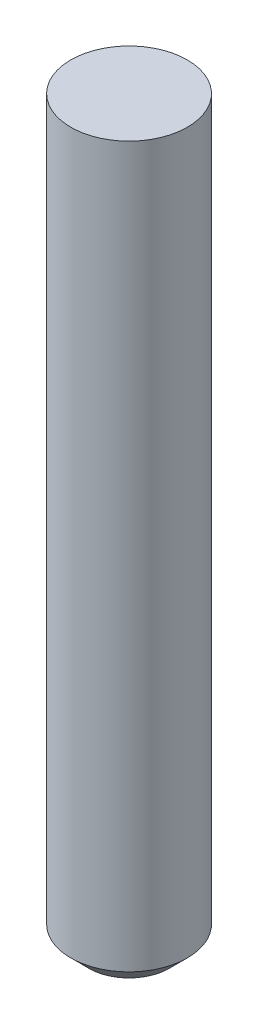
ISO-10303-21;
HEADER;
FILE_DESCRIPTION(('STEP AP214'),'2;1');
FILE_NAME('part.step','',(''),(''),'','','');
FILE_SCHEMA(('AUTOMOTIVE_DESIGN { 1 0 10303 214 1 1 1 1 }'));
ENDSEC;
DATA;
#1=APPLICATION_CONTEXT('core data for automotive mechanical design processes');
#2=APPLICATION_PROTOCOL_DEFINITION('international standard','automotive_design',2000,#1);
#3=PRODUCT_CONTEXT('',#1,'mechanical');
#4=PRODUCT('Part','Part','',(#3));
#5=PRODUCT_RELATED_PRODUCT_CATEGORY('part','',(#4));
#6=PRODUCT_DEFINITION_FORMATION('','',#4);
#7=PRODUCT_DEFINITION_CONTEXT('part definition',#1,'design');
#8=PRODUCT_DEFINITION('design','',#6,#7);
#9=PRODUCT_DEFINITION_SHAPE('','',#8);
#10=(LENGTH_UNIT() NAMED_UNIT(*) SI_UNIT(.MILLI.,.METRE.));
#11=(NAMED_UNIT(*) PLANE_ANGLE_UNIT() SI_UNIT($,.RADIAN.));
#12=(NAMED_UNIT(*) SI_UNIT($,.STERADIAN.) SOLID_ANGLE_UNIT());
#13=UNCERTAINTY_MEASURE_WITH_UNIT(LENGTH_MEASURE(1.E-05),#10,'distance_accuracy_value','');
#14=(GEOMETRIC_REPRESENTATION_CONTEXT(3) GLOBAL_UNCERTAINTY_ASSIGNED_CONTEXT((#13)) GLOBAL_UNIT_ASSIGNED_CONTEXT((#10,
#11,#12)) REPRESENTATION_CONTEXT('',''));
#15=CARTESIAN_POINT('',(0.,0.,0.));
#16=DIRECTION('',(0.,0.,1.));
#17=DIRECTION('',(1.,0.,0.));
#18=AXIS2_PLACEMENT_3D('',#15,#16,#17);
#19=CARTESIAN_POINT('',(2.,-15.12,-27.8));
#20=DIRECTION('',(0.,1.,0.));
#21=DIRECTION('',(0.,0.,1.));
#22=AXIS2_PLACEMENT_3D('',#19,#20,#21);
#23=CONICAL_SURFACE('',#22,0.55,0.7853981634);
#24=CARTESIAN_POINT('',(2.,-15.02,-27.8));
#25=DIRECTION('',(0.,-1.,0.));
#26=DIRECTION('',(0.,0.,1.));
#27=AXIS2_PLACEMENT_3D('',#24,#25,#26);
#28=CIRCLE('',#27,0.65);
#29=CARTESIAN_POINT('',(2.,-15.02,-28.45));
#30=VERTEX_POINT('',#29);
#31=EDGE_CURVE('E11',#30,#30,#28,.T.);
#32=ORIENTED_EDGE('',*,*,#31,.T.);
#33=CARTESIAN_POINT('',(2.,-15.22,-28.25));
#34=CARTESIAN_POINT('',(2.,-15.02,-28.45));
#35=B_SPLINE_CURVE_WITH_KNOTS('',1,(#33,#34),.UNSPECIFIED.,.F.,.F.,(2,2),(-0.141421356237311,
0.141421356237308),.UNSPECIFIED.);
#36=CARTESIAN_POINT('',(2.,-15.22,-28.25));
#37=VERTEX_POINT('',#36);
#38=EDGE_CURVE('E24',#37,#30,#35,.T.);
#39=ORIENTED_EDGE('',*,*,#38,.F.);
#40=CARTESIAN_POINT('',(2.,-15.22,-27.8));
#41=DIRECTION('',(0.,1.,0.));
#42=DIRECTION('',(0.,0.,1.));
#43=AXIS2_PLACEMENT_3D('',#40,#41,#42);
#44=CIRCLE('',#43,0.45);
#45=EDGE_CURVE('E42',#37,#37,#44,.T.);
#46=ORIENTED_EDGE('',*,*,#45,.T.);
#47=ORIENTED_EDGE('',*,*,#38,.T.);
#48=EDGE_LOOP('',(#32,#39,#46,#47));
#49=FACE_BOUND('',#48,.T.);
#50=ADVANCED_FACE('F17',(#49),#23,.T.);
#51=CARTESIAN_POINT('',(2.,-15.22,-27.8));
#52=DIRECTION('',(0.,-1.,0.));
#53=DIRECTION('',(0.,0.,-1.));
#54=AXIS2_PLACEMENT_3D('',#51,#52,#53);
#55=PLANE('',#54);
#56=ORIENTED_EDGE('',*,*,#45,.F.);
#57=EDGE_LOOP('',(#56));
#58=FACE_BOUND('',#57,.T.);
#59=ADVANCED_FACE('F55',(#58),#55,.T.);
#60=CARTESIAN_POINT('',(2.,-6.65,-27.8));
#61=DIRECTION('',(0.,-1.,0.));
#62=DIRECTION('',(0.,0.,-1.));
#63=AXIS2_PLACEMENT_3D('',#60,#61,#62);
#64=CYLINDRICAL_SURFACE('',#63,0.65);
#65=CARTESIAN_POINT('',(2.,-7.,-27.8));
#66=DIRECTION('',(0.,-1.,0.));
#67=DIRECTION('',(0.,0.,-1.));
#68=AXIS2_PLACEMENT_3D('',#65,#66,#67);
#69=CIRCLE('',#68,0.65);
#70=CARTESIAN_POINT('',(2.,-7.,-28.45));
#71=VERTEX_POINT('',#70);
#72=EDGE_CURVE('E38',#71,#71,#69,.T.);
#73=ORIENTED_EDGE('',*,*,#72,.T.);
#74=CARTESIAN_POINT('',(2.,-7.,-28.45));
#75=CARTESIAN_POINT('',(2.,-15.02,-28.45));
#76=B_SPLINE_CURVE_WITH_KNOTS('',1,(#74,#75),.UNSPECIFIED.,.F.,.F.,(2,2),(0.35,8.37),.UNSPECIFIED.);
#77=EDGE_CURVE('E40',#71,#30,#76,.T.);
#78=ORIENTED_EDGE('',*,*,#77,.T.);
#79=ORIENTED_EDGE('',*,*,#31,.F.);
#80=ORIENTED_EDGE('',*,*,#77,.F.);
#81=EDGE_LOOP('',(#73,#78,#79,#80));
#82=FACE_BOUND('',#81,.T.);
#83=ADVANCED_FACE('F39',(#82),#64,.T.);
#84=CARTESIAN_POINT('',(24.43110368616,-7.,-27.15));
#85=DIRECTION('',(0.,1.,0.));
#86=DIRECTION('',(0.,0.,-1.));
#87=AXIS2_PLACEMENT_3D('',#84,#85,#86);
#88=PLANE('',#87);
#89=ORIENTED_EDGE('',*,*,#72,.F.);
#90=EDGE_LOOP('',(#89));
#91=FACE_BOUND('',#90,.T.);
#92=ADVANCED_FACE('F62',(#91),#88,.T.);
#93=CLOSED_SHELL('',(#50,#59,#83,#92));
#94=MANIFOLD_SOLID_BREP('B1',#93);
#95=ADVANCED_BREP_SHAPE_REPRESENTATION('',(#18,#94),#14);
#96=SHAPE_DEFINITION_REPRESENTATION(#9,#95);
ENDSEC;
END-ISO-10303-21;
